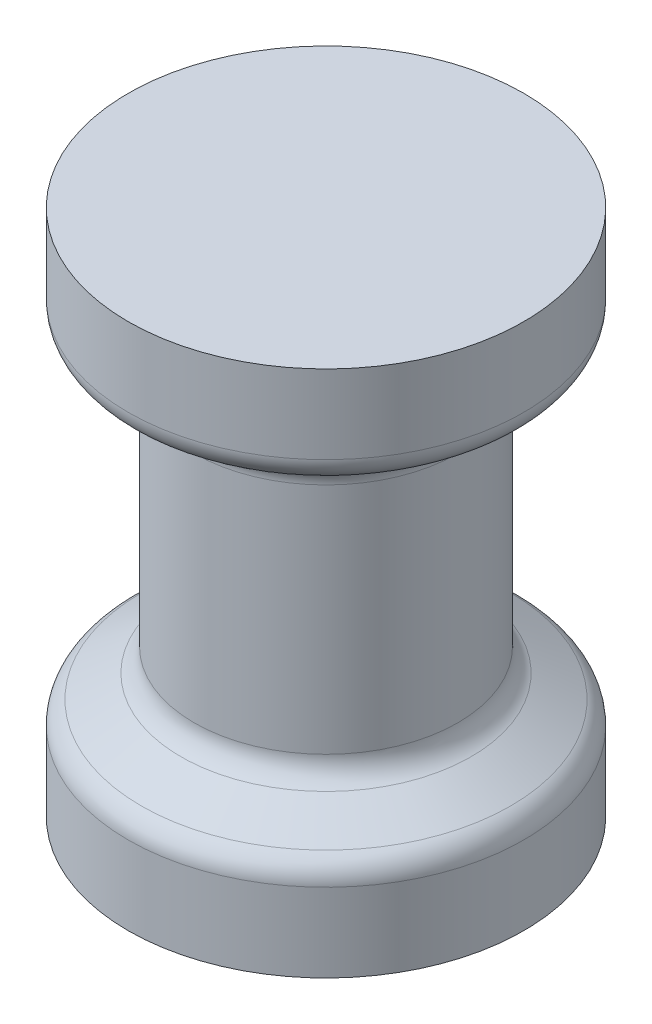
ISO-10303-21;
HEADER;
FILE_DESCRIPTION(('STEP AP214'),'2;1');
FILE_NAME('part.step','',(''),(''),'','','');
FILE_SCHEMA(('AUTOMOTIVE_DESIGN { 1 0 10303 214 1 1 1 1 }'));
ENDSEC;
DATA;
#1=APPLICATION_CONTEXT('core data for automotive mechanical design processes');
#2=APPLICATION_PROTOCOL_DEFINITION('international standard','automotive_design',2000,#1);
#3=PRODUCT_CONTEXT('',#1,'mechanical');
#4=PRODUCT('Part','Part','',(#3));
#5=PRODUCT_RELATED_PRODUCT_CATEGORY('part','',(#4));
#6=PRODUCT_DEFINITION_FORMATION('','',#4);
#7=PRODUCT_DEFINITION_CONTEXT('part definition',#1,'design');
#8=PRODUCT_DEFINITION('design','',#6,#7);
#9=PRODUCT_DEFINITION_SHAPE('','',#8);
#10=(LENGTH_UNIT() NAMED_UNIT(*) SI_UNIT(.MILLI.,.METRE.));
#11=(NAMED_UNIT(*) PLANE_ANGLE_UNIT() SI_UNIT($,.RADIAN.));
#12=(NAMED_UNIT(*) SI_UNIT($,.STERADIAN.) SOLID_ANGLE_UNIT());
#13=UNCERTAINTY_MEASURE_WITH_UNIT(LENGTH_MEASURE(1.E-05),#10,'distance_accuracy_value','');
#14=(GEOMETRIC_REPRESENTATION_CONTEXT(3) GLOBAL_UNCERTAINTY_ASSIGNED_CONTEXT((#13)) GLOBAL_UNIT_ASSIGNED_CONTEXT((#10,
#11,#12)) REPRESENTATION_CONTEXT('',''));
#15=CARTESIAN_POINT('',(0.,0.,0.));
#16=DIRECTION('',(0.,0.,1.));
#17=DIRECTION('',(1.,0.,0.));
#18=AXIS2_PLACEMENT_3D('',#15,#16,#17);
#19=CARTESIAN_POINT('',(0.,-10.,0.));
#20=DIRECTION('',(0.,1.,0.));
#21=DIRECTION('',(0.,0.,1.));
#22=AXIS2_PLACEMENT_3D('',#19,#20,#21);
#23=PLANE('',#22);
#24=CARTESIAN_POINT('',(0.,-10.,0.));
#25=DIRECTION('',(0.,-1.,0.));
#26=DIRECTION('',(0.,0.,-1.));
#27=AXIS2_PLACEMENT_3D('',#24,#25,#26);
#28=CIRCLE('',#27,7.5);
#29=CARTESIAN_POINT('',(0.,-10.,-7.5));
#30=VERTEX_POINT('',#29);
#31=EDGE_CURVE('E77',#30,#30,#28,.T.);
#32=ORIENTED_EDGE('',*,*,#31,.T.);
#33=EDGE_LOOP('',(#32));
#34=FACE_BOUND('',#33,.T.);
#35=ADVANCED_FACE('F37',(#34),#23,.F.);
#36=CARTESIAN_POINT('',(0.,-42.375,0.));
#37=DIRECTION('',(0.,-1.,0.));
#38=DIRECTION('',(0.,0.,-1.));
#39=AXIS2_PLACEMENT_3D('',#36,#37,#38);
#40=CYLINDRICAL_SURFACE('',#39,7.5);
#41=CARTESIAN_POINT('',(0.,-7.02072594216369,0.));
#42=DIRECTION('',(0.,1.,0.));
#43=DIRECTION('',(0.,0.,1.));
#44=AXIS2_PLACEMENT_3D('',#41,#42,#43);
#45=CIRCLE('',#44,7.5);
#46=CARTESIAN_POINT('',(0.,-7.02072594216369,7.5));
#47=VERTEX_POINT('',#46);
#48=EDGE_CURVE('E55',#47,#47,#45,.F.);
#49=ORIENTED_EDGE('',*,*,#48,.T.);
#50=EDGE_LOOP('',(#49));
#51=FACE_BOUND('',#50,.T.);
#52=ORIENTED_EDGE('',*,*,#31,.F.);
#53=EDGE_LOOP('',(#52));
#54=FACE_BOUND('',#53,.T.);
#55=ADVANCED_FACE('F102',(#51,#54),#40,.T.);
#56=CARTESIAN_POINT('',(0.,-5.00000000000001,0.));
#57=DIRECTION('',(0.,-1.,0.));
#58=DIRECTION('',(0.,0.,-1.));
#59=AXIS2_PLACEMENT_3D('',#56,#57,#58);
#60=CONICAL_SURFACE('',#59,5.,1.0471975511966);
#61=CARTESIAN_POINT('',(0.,-6.15470053837925,0.));
#62=DIRECTION('',(0.,1.,0.));
#63=DIRECTION('',(0.,0.,1.));
#64=AXIS2_PLACEMENT_3D('',#61,#62,#63);
#65=CIRCLE('',#64,7.);
#66=CARTESIAN_POINT('',(0.,-6.15470053837925,7.));
#67=VERTEX_POINT('',#66);
#68=EDGE_CURVE('E50',#67,#67,#65,.T.);
#69=ORIENTED_EDGE('',*,*,#68,.T.);
#70=EDGE_LOOP('',(#69));
#71=FACE_BOUND('',#70,.T.);
#72=CARTESIAN_POINT('',(0.,-5.28867513459482,0.));
#73=DIRECTION('',(0.,-1.,0.));
#74=DIRECTION('',(0.,0.,-1.));
#75=AXIS2_PLACEMENT_3D('',#72,#73,#74);
#76=CIRCLE('',#75,5.5);
#77=CARTESIAN_POINT('',(0.,-5.28867513459482,-5.5));
#78=VERTEX_POINT('',#77);
#79=EDGE_CURVE('E73',#78,#78,#76,.T.);
#80=ORIENTED_EDGE('',*,*,#79,.T.);
#81=EDGE_LOOP('',(#80));
#82=FACE_BOUND('',#81,.T.);
#83=ADVANCED_FACE('F108',(#71,#82),#60,.T.);
#84=CARTESIAN_POINT('',(0.,-42.375,0.));
#85=DIRECTION('',(0.,-1.,0.));
#86=DIRECTION('',(0.,0.,-1.));
#87=AXIS2_PLACEMENT_3D('',#84,#85,#86);
#88=CYLINDRICAL_SURFACE('',#87,5.);
#89=CARTESIAN_POINT('',(0.,-4.42264973081039,0.));
#90=DIRECTION('',(0.,-1.,0.));
#91=DIRECTION('',(0.,0.,-1.));
#92=AXIS2_PLACEMENT_3D('',#89,#90,#91);
#93=CIRCLE('',#92,5.);
#94=CARTESIAN_POINT('',(0.,-4.42264973081039,-5.));
#95=VERTEX_POINT('',#94);
#96=EDGE_CURVE('E65',#95,#95,#93,.F.);
#97=ORIENTED_EDGE('',*,*,#96,.T.);
#98=EDGE_LOOP('',(#97));
#99=FACE_BOUND('',#98,.T.);
#100=CARTESIAN_POINT('',(0.,4.42264973081036,0.));
#101=DIRECTION('',(0.,-1.,0.));
#102=DIRECTION('',(0.,0.,-1.));
#103=AXIS2_PLACEMENT_3D('',#100,#101,#102);
#104=CIRCLE('',#103,5.);
#105=CARTESIAN_POINT('',(0.,4.42264973081036,-5.));
#106=VERTEX_POINT('',#105);
#107=EDGE_CURVE('E69',#106,#106,#104,.T.);
#108=ORIENTED_EDGE('',*,*,#107,.T.);
#109=EDGE_LOOP('',(#108));
#110=FACE_BOUND('',#109,.T.);
#111=ADVANCED_FACE('F130',(#99,#110),#88,.T.);
#112=CARTESIAN_POINT('',(0.,6.44337567297405,0.));
#113=DIRECTION('',(0.,1.,0.));
#114=DIRECTION('',(0.,0.,1.));
#115=AXIS2_PLACEMENT_3D('',#112,#113,#114);
#116=CONICAL_SURFACE('',#115,7.5,1.0471975511966);
#117=CARTESIAN_POINT('',(0.,6.15470053837923,0.));
#118=DIRECTION('',(0.,-1.,0.));
#119=DIRECTION('',(0.,0.,-1.));
#120=AXIS2_PLACEMENT_3D('',#117,#118,#119);
#121=CIRCLE('',#120,7.);
#122=CARTESIAN_POINT('',(0.,6.15470053837923,-7.));
#123=VERTEX_POINT('',#122);
#124=EDGE_CURVE('E45',#123,#123,#121,.T.);
#125=ORIENTED_EDGE('',*,*,#124,.T.);
#126=EDGE_LOOP('',(#125));
#127=FACE_BOUND('',#126,.T.);
#128=CARTESIAN_POINT('',(0.,5.2886751345948,0.));
#129=DIRECTION('',(0.,1.,0.));
#130=DIRECTION('',(0.,0.,1.));
#131=AXIS2_PLACEMENT_3D('',#128,#129,#130);
#132=CIRCLE('',#131,5.5);
#133=CARTESIAN_POINT('',(0.,5.2886751345948,5.5));
#134=VERTEX_POINT('',#133);
#135=EDGE_CURVE('E61',#134,#134,#132,.T.);
#136=ORIENTED_EDGE('',*,*,#135,.T.);
#137=EDGE_LOOP('',(#136));
#138=FACE_BOUND('',#137,.T.);
#139=ADVANCED_FACE('F99',(#127,#138),#116,.T.);
#140=CARTESIAN_POINT('',(0.,-42.375,0.));
#141=DIRECTION('',(0.,-1.,0.));
#142=DIRECTION('',(0.,0.,-1.));
#143=AXIS2_PLACEMENT_3D('',#140,#141,#142);
#144=CYLINDRICAL_SURFACE('',#143,7.5);
#145=CARTESIAN_POINT('',(0.,7.02072594216367,0.));
#146=DIRECTION('',(0.,1.,0.));
#147=DIRECTION('',(0.,0.,1.));
#148=AXIS2_PLACEMENT_3D('',#145,#146,#147);
#149=CIRCLE('',#148,7.5);
#150=CARTESIAN_POINT('',(0.,7.02072594216367,7.5));
#151=VERTEX_POINT('',#150);
#152=EDGE_CURVE('E10',#151,#151,#149,.T.);
#153=ORIENTED_EDGE('',*,*,#152,.T.);
#154=EDGE_LOOP('',(#153));
#155=FACE_BOUND('',#154,.T.);
#156=CARTESIAN_POINT('',(0.,9.99999999999999,0.));
#157=DIRECTION('',(0.,-1.,0.));
#158=DIRECTION('',(0.,0.,-1.));
#159=AXIS2_PLACEMENT_3D('',#156,#157,#158);
#160=CIRCLE('',#159,7.5);
#161=CARTESIAN_POINT('',(0.,9.99999999999999,-7.5));
#162=VERTEX_POINT('',#161);
#163=EDGE_CURVE('E81',#162,#162,#160,.T.);
#164=ORIENTED_EDGE('',*,*,#163,.T.);
#165=EDGE_LOOP('',(#164));
#166=FACE_BOUND('',#165,.T.);
#167=ADVANCED_FACE('F86',(#155,#166),#144,.T.);
#168=CARTESIAN_POINT('',(0.,9.99999999999999,0.));
#169=DIRECTION('',(0.,-1.,0.));
#170=DIRECTION('',(0.,0.,-1.));
#171=AXIS2_PLACEMENT_3D('',#168,#169,#170);
#172=PLANE('',#171);
#173=ORIENTED_EDGE('',*,*,#163,.F.);
#174=EDGE_LOOP('',(#173));
#175=FACE_BOUND('',#174,.T.);
#176=ADVANCED_FACE('F88',(#175),#172,.F.);
#177=CARTESIAN_POINT('',(0.,-4.42264973081039,0.));
#178=DIRECTION('',(0.,-1.,0.));
#179=DIRECTION('',(0.,0.,-1.));
#180=AXIS2_PLACEMENT_3D('',#177,#178,#179);
#181=TOROIDAL_SURFACE('',#180,6.,1.);
#182=ORIENTED_EDGE('',*,*,#96,.F.);
#183=EDGE_LOOP('',(#182));
#184=FACE_BOUND('',#183,.T.);
#185=ORIENTED_EDGE('',*,*,#79,.F.);
#186=EDGE_LOOP('',(#185));
#187=FACE_BOUND('',#186,.T.);
#188=ADVANCED_FACE('F90',(#184,#187),#181,.F.);
#189=CARTESIAN_POINT('',(0.,4.42264973081036,0.));
#190=DIRECTION('',(0.,-1.,0.));
#191=DIRECTION('',(0.,0.,-1.));
#192=AXIS2_PLACEMENT_3D('',#189,#190,#191);
#193=TOROIDAL_SURFACE('',#192,6.,1.);
#194=ORIENTED_EDGE('',*,*,#135,.F.);
#195=EDGE_LOOP('',(#194));
#196=FACE_BOUND('',#195,.T.);
#197=ORIENTED_EDGE('',*,*,#107,.F.);
#198=EDGE_LOOP('',(#197));
#199=FACE_BOUND('',#198,.T.);
#200=ADVANCED_FACE('F96',(#196,#199),#193,.F.);
#201=CARTESIAN_POINT('',(0.,-7.02072594216369,0.));
#202=DIRECTION('',(0.,1.,0.));
#203=DIRECTION('',(0.,0.,1.));
#204=AXIS2_PLACEMENT_3D('',#201,#202,#203);
#205=TOROIDAL_SURFACE('',#204,6.5,1.);
#206=ORIENTED_EDGE('',*,*,#68,.F.);
#207=EDGE_LOOP('',(#206));
#208=FACE_BOUND('',#207,.T.);
#209=ORIENTED_EDGE('',*,*,#48,.F.);
#210=EDGE_LOOP('',(#209));
#211=FACE_BOUND('',#210,.T.);
#212=ADVANCED_FACE('F114',(#208,#211),#205,.T.);
#213=CARTESIAN_POINT('',(0.,7.02072594216367,0.));
#214=DIRECTION('',(0.,1.,0.));
#215=DIRECTION('',(0.,0.,1.));
#216=AXIS2_PLACEMENT_3D('',#213,#214,#215);
#217=TOROIDAL_SURFACE('',#216,6.5,1.);
#218=ORIENTED_EDGE('',*,*,#152,.F.);
#219=EDGE_LOOP('',(#218));
#220=FACE_BOUND('',#219,.T.);
#221=ORIENTED_EDGE('',*,*,#124,.F.);
#222=EDGE_LOOP('',(#221));
#223=FACE_BOUND('',#222,.T.);
#224=ADVANCED_FACE('F39',(#220,#223),#217,.T.);
#225=CLOSED_SHELL('',(#35,#55,#83,#111,#139,#167,#176,#188,#200,#212,#224));
#226=MANIFOLD_SOLID_BREP('B2',#225);
#227=ADVANCED_BREP_SHAPE_REPRESENTATION('',(#18,#226),#14);
#228=SHAPE_DEFINITION_REPRESENTATION(#9,#227);
ENDSEC;
END-ISO-10303-21;
